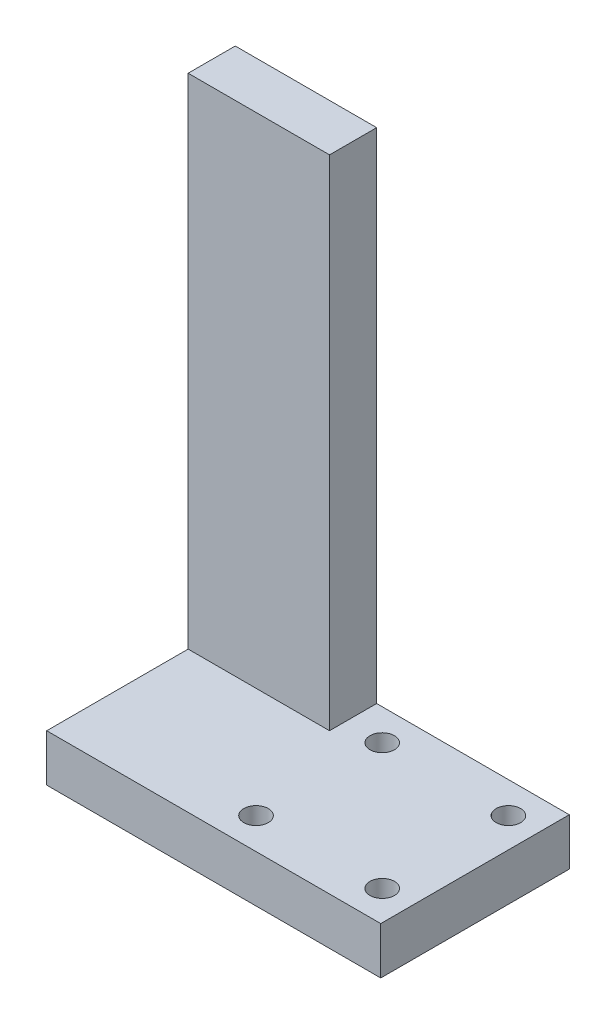
ISO-10303-21;
HEADER;
FILE_DESCRIPTION(('STEP AP214'),'2;1');
FILE_NAME('part.step','',(''),(''),'','','');
FILE_SCHEMA(('AUTOMOTIVE_DESIGN { 1 0 10303 214 1 1 1 1 }'));
ENDSEC;
DATA;
#1=APPLICATION_CONTEXT('core data for automotive mechanical design processes');
#2=APPLICATION_PROTOCOL_DEFINITION('international standard','automotive_design',2000,#1);
#3=PRODUCT_CONTEXT('',#1,'mechanical');
#4=PRODUCT('Part','Part','',(#3));
#5=PRODUCT_RELATED_PRODUCT_CATEGORY('part','',(#4));
#6=PRODUCT_DEFINITION_FORMATION('','',#4);
#7=PRODUCT_DEFINITION_CONTEXT('part definition',#1,'design');
#8=PRODUCT_DEFINITION('design','',#6,#7);
#9=PRODUCT_DEFINITION_SHAPE('','',#8);
#10=(LENGTH_UNIT() NAMED_UNIT(*) SI_UNIT(.MILLI.,.METRE.));
#11=(NAMED_UNIT(*) PLANE_ANGLE_UNIT() SI_UNIT($,.RADIAN.));
#12=(NAMED_UNIT(*) SI_UNIT($,.STERADIAN.) SOLID_ANGLE_UNIT());
#13=UNCERTAINTY_MEASURE_WITH_UNIT(LENGTH_MEASURE(1.E-05),#10,'distance_accuracy_value','');
#14=(GEOMETRIC_REPRESENTATION_CONTEXT(3) GLOBAL_UNCERTAINTY_ASSIGNED_CONTEXT((#13)) GLOBAL_UNIT_ASSIGNED_CONTEXT((#10,
#11,#12)) REPRESENTATION_CONTEXT('',''));
#15=CARTESIAN_POINT('',(0.,0.,0.));
#16=DIRECTION('',(0.,0.,1.));
#17=DIRECTION('',(1.,0.,0.));
#18=AXIS2_PLACEMENT_3D('',#15,#16,#17);
#19=CARTESIAN_POINT('',(0.,6.35,0.));
#20=DIRECTION('',(0.,-1.,0.));
#21=DIRECTION('',(0.,0.,-1.));
#22=AXIS2_PLACEMENT_3D('',#19,#20,#21);
#23=PLANE('',#22);
#24=CARTESIAN_POINT('',(3.00000000002082,6.35,-17.));
#25=DIRECTION('',(0.,-1.,0.));
#26=DIRECTION('',(0.,0.,-1.));
#27=AXIS2_PLACEMENT_3D('',#24,#25,#26);
#28=CIRCLE('',#27,3.3);
#29=CARTESIAN_POINT('',(3.00000000002082,6.35,-20.3));
#30=VERTEX_POINT('',#29);
#31=EDGE_CURVE('E141',#30,#30,#28,.T.);
#32=ORIENTED_EDGE('',*,*,#31,.T.);
#33=EDGE_LOOP('',(#32));
#34=FACE_BOUND('',#33,.T.);
#35=CARTESIAN_POINT('',(3.00000000002082,6.35,17.));
#36=DIRECTION('',(0.,-1.,0.));
#37=DIRECTION('',(0.,0.,-1.));
#38=AXIS2_PLACEMENT_3D('',#35,#36,#37);
#39=CIRCLE('',#38,3.3);
#40=CARTESIAN_POINT('',(3.00000000002082,6.35,13.7));
#41=VERTEX_POINT('',#40);
#42=EDGE_CURVE('E135',#41,#41,#39,.T.);
#43=ORIENTED_EDGE('',*,*,#42,.T.);
#44=EDGE_LOOP('',(#43));
#45=FACE_BOUND('',#44,.T.);
#46=CARTESIAN_POINT('',(37.0000000000208,6.35,-17.));
#47=DIRECTION('',(0.,-1.,0.));
#48=DIRECTION('',(0.,0.,-1.));
#49=AXIS2_PLACEMENT_3D('',#46,#47,#48);
#50=CIRCLE('',#49,3.3);
#51=CARTESIAN_POINT('',(37.0000000000208,6.35,-20.3));
#52=VERTEX_POINT('',#51);
#53=EDGE_CURVE('E129',#52,#52,#50,.T.);
#54=ORIENTED_EDGE('',*,*,#53,.T.);
#55=EDGE_LOOP('',(#54));
#56=FACE_BOUND('',#55,.T.);
#57=CARTESIAN_POINT('',(37.0000000000208,6.35,17.));
#58=DIRECTION('',(0.,-1.,0.));
#59=DIRECTION('',(0.,0.,-1.));
#60=AXIS2_PLACEMENT_3D('',#57,#58,#59);
#61=CIRCLE('',#60,3.3);
#62=CARTESIAN_POINT('',(37.0000000000208,6.35,13.7));
#63=VERTEX_POINT('',#62);
#64=EDGE_CURVE('E117',#63,#63,#61,.T.);
#65=ORIENTED_EDGE('',*,*,#64,.T.);
#66=EDGE_LOOP('',(#65));
#67=FACE_BOUND('',#66,.T.);
#68=DIRECTION('',(0.,0.,-1.));
#69=VECTOR('',#68,1.);
#70=CARTESIAN_POINT('',(-6.9,6.35,-25.4));
#71=LINE('',#70,#69);
#72=CARTESIAN_POINT('',(-6.9,6.35,-12.7));
#73=VERTEX_POINT('',#72);
#74=CARTESIAN_POINT('',(-6.89999999999999,6.35,-25.4));
#75=VERTEX_POINT('',#74);
#76=EDGE_CURVE('E112',#73,#75,#71,.T.);
#77=ORIENTED_EDGE('',*,*,#76,.F.);
#78=DIRECTION('',(1.,0.,0.));
#79=VECTOR('',#78,1.);
#80=CARTESIAN_POINT('',(-6.9,6.35,-12.7));
#81=LINE('',#80,#79);
#82=CARTESIAN_POINT('',(-45.,6.35,-12.7));
#83=VERTEX_POINT('',#82);
#84=EDGE_CURVE('E54',#83,#73,#81,.T.);
#85=ORIENTED_EDGE('',*,*,#84,.F.);
#86=DIRECTION('',(0.,0.,1.));
#87=VECTOR('',#86,1.);
#88=CARTESIAN_POINT('',(-45.,6.35,-25.4));
#89=LINE('',#88,#87);
#90=CARTESIAN_POINT('',(-45.,6.35,25.4));
#91=VERTEX_POINT('',#90);
#92=EDGE_CURVE('E145',#83,#91,#89,.T.);
#93=ORIENTED_EDGE('',*,*,#92,.T.);
#94=DIRECTION('',(1.,0.,0.));
#95=VECTOR('',#94,1.);
#96=CARTESIAN_POINT('',(45.,6.35,25.4));
#97=LINE('',#96,#95);
#98=CARTESIAN_POINT('',(45.,6.35,25.4));
#99=VERTEX_POINT('',#98);
#100=EDGE_CURVE('E147',#91,#99,#97,.T.);
#101=ORIENTED_EDGE('',*,*,#100,.T.);
#102=DIRECTION('',(0.,0.,-1.));
#103=VECTOR('',#102,1.);
#104=CARTESIAN_POINT('',(45.,6.35,-25.4));
#105=LINE('',#104,#103);
#106=CARTESIAN_POINT('',(45.,6.35,-25.4));
#107=VERTEX_POINT('',#106);
#108=EDGE_CURVE('E150',#99,#107,#105,.T.);
#109=ORIENTED_EDGE('',*,*,#108,.T.);
#110=DIRECTION('',(-1.,0.,0.));
#111=VECTOR('',#110,1.);
#112=CARTESIAN_POINT('',(45.,6.35,-25.4));
#113=LINE('',#112,#111);
#114=EDGE_CURVE('E48',#107,#75,#113,.T.);
#115=ORIENTED_EDGE('',*,*,#114,.T.);
#116=EDGE_LOOP('',(#77,#85,#93,#101,#109,#115));
#117=FACE_BOUND('',#116,.T.);
#118=ADVANCED_FACE('F33',(#34,#45,#56,#67,#117),#23,.F.);
#119=CARTESIAN_POINT('',(-45.,6.35,-25.4));
#120=DIRECTION('',(1.,0.,0.));
#121=DIRECTION('',(0.,0.,-1.));
#122=AXIS2_PLACEMENT_3D('',#119,#120,#121);
#123=PLANE('',#122);
#124=DIRECTION('',(0.,0.,1.));
#125=VECTOR('',#124,1.);
#126=CARTESIAN_POINT('',(-45.,-6.35,-25.4));
#127=LINE('',#126,#125);
#128=CARTESIAN_POINT('',(-45.,-6.35,-25.4));
#129=VERTEX_POINT('',#128);
#130=CARTESIAN_POINT('',(-45.,-6.35,25.4));
#131=VERTEX_POINT('',#130);
#132=EDGE_CURVE('E144',#129,#131,#127,.T.);
#133=ORIENTED_EDGE('',*,*,#132,.T.);
#134=DIRECTION('',(0.,-1.,0.));
#135=VECTOR('',#134,1.);
#136=CARTESIAN_POINT('',(-45.,6.35,25.4));
#137=LINE('',#136,#135);
#138=EDGE_CURVE('E11',#91,#131,#137,.T.);
#139=ORIENTED_EDGE('',*,*,#138,.F.);
#140=ORIENTED_EDGE('',*,*,#92,.F.);
#141=DIRECTION('',(0.,-1.,0.));
#142=VECTOR('',#141,1.);
#143=CARTESIAN_POINT('',(-45.,140.73,-12.7));
#144=LINE('',#143,#142);
#145=CARTESIAN_POINT('',(-45.,140.73,-12.7));
#146=VERTEX_POINT('',#145);
#147=EDGE_CURVE('E114',#146,#83,#144,.T.);
#148=ORIENTED_EDGE('',*,*,#147,.F.);
#149=DIRECTION('',(0.,0.,1.));
#150=VECTOR('',#149,1.);
#151=CARTESIAN_POINT('',(-45.,140.73,-25.4));
#152=LINE('',#151,#150);
#153=CARTESIAN_POINT('',(-45.,140.73,-25.4));
#154=VERTEX_POINT('',#153);
#155=EDGE_CURVE('E100',#154,#146,#152,.T.);
#156=ORIENTED_EDGE('',*,*,#155,.F.);
#157=DIRECTION('',(0.,-1.,0.));
#158=VECTOR('',#157,1.);
#159=CARTESIAN_POINT('',(-45.,6.35,-25.4));
#160=LINE('',#159,#158);
#161=EDGE_CURVE('E97',#154,#129,#160,.T.);
#162=ORIENTED_EDGE('',*,*,#161,.T.);
#163=EDGE_LOOP('',(#133,#139,#140,#148,#156,#162));
#164=FACE_BOUND('',#163,.T.);
#165=ADVANCED_FACE('F35',(#164),#123,.F.);
#166=CARTESIAN_POINT('',(45.,6.35,25.4));
#167=DIRECTION('',(0.,0.,-1.));
#168=DIRECTION('',(-1.,0.,0.));
#169=AXIS2_PLACEMENT_3D('',#166,#167,#168);
#170=PLANE('',#169);
#171=DIRECTION('',(1.,0.,0.));
#172=VECTOR('',#171,1.);
#173=CARTESIAN_POINT('',(45.,-6.35,25.4));
#174=LINE('',#173,#172);
#175=CARTESIAN_POINT('',(45.,-6.35,25.4));
#176=VERTEX_POINT('',#175);
#177=EDGE_CURVE('E155',#131,#176,#174,.T.);
#178=ORIENTED_EDGE('',*,*,#177,.T.);
#179=DIRECTION('',(0.,-1.,0.));
#180=VECTOR('',#179,1.);
#181=CARTESIAN_POINT('',(45.,6.35,25.4));
#182=LINE('',#181,#180);
#183=EDGE_CURVE('E41',#99,#176,#182,.T.);
#184=ORIENTED_EDGE('',*,*,#183,.F.);
#185=ORIENTED_EDGE('',*,*,#100,.F.);
#186=ORIENTED_EDGE('',*,*,#138,.T.);
#187=EDGE_LOOP('',(#178,#184,#185,#186));
#188=FACE_BOUND('',#187,.T.);
#189=ADVANCED_FACE('F200',(#188),#170,.F.);
#190=CARTESIAN_POINT('',(45.,6.35,-25.4));
#191=DIRECTION('',(-1.,0.,0.));
#192=DIRECTION('',(0.,0.,1.));
#193=AXIS2_PLACEMENT_3D('',#190,#191,#192);
#194=PLANE('',#193);
#195=DIRECTION('',(0.,0.,-1.));
#196=VECTOR('',#195,1.);
#197=CARTESIAN_POINT('',(45.,-6.35,-25.4));
#198=LINE('',#197,#196);
#199=CARTESIAN_POINT('',(45.,-6.35,-25.4));
#200=VERTEX_POINT('',#199);
#201=EDGE_CURVE('E157',#176,#200,#198,.T.);
#202=ORIENTED_EDGE('',*,*,#201,.T.);
#203=DIRECTION('',(0.,-1.,0.));
#204=VECTOR('',#203,1.);
#205=CARTESIAN_POINT('',(45.,6.35,-25.4));
#206=LINE('',#205,#204);
#207=EDGE_CURVE('E161',#107,#200,#206,.T.);
#208=ORIENTED_EDGE('',*,*,#207,.F.);
#209=ORIENTED_EDGE('',*,*,#108,.F.);
#210=ORIENTED_EDGE('',*,*,#183,.T.);
#211=EDGE_LOOP('',(#202,#208,#209,#210));
#212=FACE_BOUND('',#211,.T.);
#213=ADVANCED_FACE('F168',(#212),#194,.F.);
#214=CARTESIAN_POINT('',(45.,6.35,-25.4));
#215=DIRECTION('',(0.,0.,1.));
#216=DIRECTION('',(1.,0.,0.));
#217=AXIS2_PLACEMENT_3D('',#214,#215,#216);
#218=PLANE('',#217);
#219=DIRECTION('',(-1.,0.,0.));
#220=VECTOR('',#219,1.);
#221=CARTESIAN_POINT('',(45.,-6.35,-25.4));
#222=LINE('',#221,#220);
#223=EDGE_CURVE('E148',#200,#129,#222,.T.);
#224=ORIENTED_EDGE('',*,*,#223,.T.);
#225=ORIENTED_EDGE('',*,*,#161,.F.);
#226=DIRECTION('',(-1.,0.,0.));
#227=VECTOR('',#226,1.);
#228=CARTESIAN_POINT('',(-6.9,140.73,-25.4));
#229=LINE('',#228,#227);
#230=CARTESIAN_POINT('',(-6.9,140.73,-25.4));
#231=VERTEX_POINT('',#230);
#232=EDGE_CURVE('E90',#231,#154,#229,.T.);
#233=ORIENTED_EDGE('',*,*,#232,.F.);
#234=DIRECTION('',(0.,-1.,0.));
#235=VECTOR('',#234,1.);
#236=CARTESIAN_POINT('',(-6.9,140.73,-25.4));
#237=LINE('',#236,#235);
#238=EDGE_CURVE('E94',#231,#75,#237,.T.);
#239=ORIENTED_EDGE('',*,*,#238,.T.);
#240=ORIENTED_EDGE('',*,*,#114,.F.);
#241=ORIENTED_EDGE('',*,*,#207,.T.);
#242=EDGE_LOOP('',(#224,#225,#233,#239,#240,#241));
#243=FACE_BOUND('',#242,.T.);
#244=ADVANCED_FACE('F92',(#243),#218,.F.);
#245=CARTESIAN_POINT('',(0.,-6.35,0.));
#246=DIRECTION('',(0.,-1.,0.));
#247=DIRECTION('',(0.,0.,-1.));
#248=AXIS2_PLACEMENT_3D('',#245,#246,#247);
#249=PLANE('',#248);
#250=CARTESIAN_POINT('',(37.0000000000208,-6.35,17.));
#251=DIRECTION('',(0.,-1.,0.));
#252=DIRECTION('',(0.,0.,-1.));
#253=AXIS2_PLACEMENT_3D('',#250,#251,#252);
#254=CIRCLE('',#253,3.3);
#255=CARTESIAN_POINT('',(37.0000000000208,-6.35,13.7));
#256=VERTEX_POINT('',#255);
#257=EDGE_CURVE('E113',#256,#256,#254,.T.);
#258=ORIENTED_EDGE('',*,*,#257,.F.);
#259=EDGE_LOOP('',(#258));
#260=FACE_BOUND('',#259,.T.);
#261=CARTESIAN_POINT('',(37.0000000000208,-6.35,-17.));
#262=DIRECTION('',(0.,-1.,0.));
#263=DIRECTION('',(0.,0.,-1.));
#264=AXIS2_PLACEMENT_3D('',#261,#262,#263);
#265=CIRCLE('',#264,3.3);
#266=CARTESIAN_POINT('',(37.0000000000208,-6.35,-20.3));
#267=VERTEX_POINT('',#266);
#268=EDGE_CURVE('E126',#267,#267,#265,.T.);
#269=ORIENTED_EDGE('',*,*,#268,.F.);
#270=EDGE_LOOP('',(#269));
#271=FACE_BOUND('',#270,.T.);
#272=CARTESIAN_POINT('',(3.00000000002082,-6.35,17.));
#273=DIRECTION('',(0.,-1.,0.));
#274=DIRECTION('',(0.,0.,-1.));
#275=AXIS2_PLACEMENT_3D('',#272,#273,#274);
#276=CIRCLE('',#275,3.3);
#277=CARTESIAN_POINT('',(3.00000000002082,-6.35,13.7));
#278=VERTEX_POINT('',#277);
#279=EDGE_CURVE('E132',#278,#278,#276,.T.);
#280=ORIENTED_EDGE('',*,*,#279,.F.);
#281=EDGE_LOOP('',(#280));
#282=FACE_BOUND('',#281,.T.);
#283=CARTESIAN_POINT('',(3.00000000002082,-6.35,-17.));
#284=DIRECTION('',(0.,-1.,0.));
#285=DIRECTION('',(0.,0.,-1.));
#286=AXIS2_PLACEMENT_3D('',#283,#284,#285);
#287=CIRCLE('',#286,3.3);
#288=CARTESIAN_POINT('',(3.00000000002082,-6.35,-20.3));
#289=VERTEX_POINT('',#288);
#290=EDGE_CURVE('E138',#289,#289,#287,.T.);
#291=ORIENTED_EDGE('',*,*,#290,.F.);
#292=EDGE_LOOP('',(#291));
#293=FACE_BOUND('',#292,.T.);
#294=ORIENTED_EDGE('',*,*,#132,.F.);
#295=ORIENTED_EDGE('',*,*,#223,.F.);
#296=ORIENTED_EDGE('',*,*,#201,.F.);
#297=ORIENTED_EDGE('',*,*,#177,.F.);
#298=EDGE_LOOP('',(#294,#295,#296,#297));
#299=FACE_BOUND('',#298,.T.);
#300=ADVANCED_FACE('F175',(#260,#271,#282,#293,#299),#249,.T.);
#301=CARTESIAN_POINT('',(3.00000000002082,-6.35,-17.));
#302=DIRECTION('',(0.,-1.,0.));
#303=DIRECTION('',(0.,0.,-1.));
#304=AXIS2_PLACEMENT_3D('',#301,#302,#303);
#305=CYLINDRICAL_SURFACE('',#304,3.3);
#306=ORIENTED_EDGE('',*,*,#31,.F.);
#307=EDGE_LOOP('',(#306));
#308=FACE_BOUND('',#307,.T.);
#309=ORIENTED_EDGE('',*,*,#290,.T.);
#310=EDGE_LOOP('',(#309));
#311=FACE_BOUND('',#310,.T.);
#312=ADVANCED_FACE('F204',(#308,#311),#305,.F.);
#313=CARTESIAN_POINT('',(3.00000000002082,-6.35,17.));
#314=DIRECTION('',(0.,-1.,0.));
#315=DIRECTION('',(0.,0.,-1.));
#316=AXIS2_PLACEMENT_3D('',#313,#314,#315);
#317=CYLINDRICAL_SURFACE('',#316,3.3);
#318=ORIENTED_EDGE('',*,*,#42,.F.);
#319=EDGE_LOOP('',(#318));
#320=FACE_BOUND('',#319,.T.);
#321=ORIENTED_EDGE('',*,*,#279,.T.);
#322=EDGE_LOOP('',(#321));
#323=FACE_BOUND('',#322,.T.);
#324=ADVANCED_FACE('F236',(#320,#323),#317,.F.);
#325=CARTESIAN_POINT('',(37.0000000000208,-6.35,-17.));
#326=DIRECTION('',(0.,-1.,0.));
#327=DIRECTION('',(0.,0.,-1.));
#328=AXIS2_PLACEMENT_3D('',#325,#326,#327);
#329=CYLINDRICAL_SURFACE('',#328,3.3);
#330=ORIENTED_EDGE('',*,*,#53,.F.);
#331=EDGE_LOOP('',(#330));
#332=FACE_BOUND('',#331,.T.);
#333=ORIENTED_EDGE('',*,*,#268,.T.);
#334=EDGE_LOOP('',(#333));
#335=FACE_BOUND('',#334,.T.);
#336=ADVANCED_FACE('F243',(#332,#335),#329,.F.);
#337=CARTESIAN_POINT('',(37.0000000000208,-6.35,17.));
#338=DIRECTION('',(0.,-1.,0.));
#339=DIRECTION('',(0.,0.,-1.));
#340=AXIS2_PLACEMENT_3D('',#337,#338,#339);
#341=CYLINDRICAL_SURFACE('',#340,3.3);
#342=ORIENTED_EDGE('',*,*,#64,.F.);
#343=EDGE_LOOP('',(#342));
#344=FACE_BOUND('',#343,.T.);
#345=ORIENTED_EDGE('',*,*,#257,.T.);
#346=EDGE_LOOP('',(#345));
#347=FACE_BOUND('',#346,.T.);
#348=ADVANCED_FACE('F192',(#344,#347),#341,.F.);
#349=CARTESIAN_POINT('',(-6.9,140.73,-25.4));
#350=DIRECTION('',(-1.,0.,0.));
#351=DIRECTION('',(0.,0.,1.));
#352=AXIS2_PLACEMENT_3D('',#349,#350,#351);
#353=PLANE('',#352);
#354=ORIENTED_EDGE('',*,*,#76,.T.);
#355=ORIENTED_EDGE('',*,*,#238,.F.);
#356=DIRECTION('',(0.,0.,-1.));
#357=VECTOR('',#356,1.);
#358=CARTESIAN_POINT('',(-6.9,140.73,-25.4));
#359=LINE('',#358,#357);
#360=CARTESIAN_POINT('',(-6.9,140.73,-12.7));
#361=VERTEX_POINT('',#360);
#362=EDGE_CURVE('E101',#361,#231,#359,.T.);
#363=ORIENTED_EDGE('',*,*,#362,.F.);
#364=DIRECTION('',(0.,-1.,0.));
#365=VECTOR('',#364,1.);
#366=CARTESIAN_POINT('',(-6.9,140.73,-12.7));
#367=LINE('',#366,#365);
#368=EDGE_CURVE('E120',#361,#73,#367,.T.);
#369=ORIENTED_EDGE('',*,*,#368,.T.);
#370=EDGE_LOOP('',(#354,#355,#363,#369));
#371=FACE_BOUND('',#370,.T.);
#372=ADVANCED_FACE('F111',(#371),#353,.F.);
#373=CARTESIAN_POINT('',(-6.9,140.73,-12.7));
#374=DIRECTION('',(0.,0.,-1.));
#375=DIRECTION('',(-1.,0.,0.));
#376=AXIS2_PLACEMENT_3D('',#373,#374,#375);
#377=PLANE('',#376);
#378=ORIENTED_EDGE('',*,*,#84,.T.);
#379=ORIENTED_EDGE('',*,*,#368,.F.);
#380=DIRECTION('',(1.,0.,0.));
#381=VECTOR('',#380,1.);
#382=CARTESIAN_POINT('',(-6.9,140.73,-12.7));
#383=LINE('',#382,#381);
#384=EDGE_CURVE('E106',#146,#361,#383,.T.);
#385=ORIENTED_EDGE('',*,*,#384,.F.);
#386=ORIENTED_EDGE('',*,*,#147,.T.);
#387=EDGE_LOOP('',(#378,#379,#385,#386));
#388=FACE_BOUND('',#387,.T.);
#389=ADVANCED_FACE('F184',(#388),#377,.F.);
#390=CARTESIAN_POINT('',(0.,140.73,0.));
#391=DIRECTION('',(0.,-1.,0.));
#392=DIRECTION('',(0.,0.,-1.));
#393=AXIS2_PLACEMENT_3D('',#390,#391,#392);
#394=PLANE('',#393);
#395=ORIENTED_EDGE('',*,*,#362,.T.);
#396=ORIENTED_EDGE('',*,*,#232,.T.);
#397=ORIENTED_EDGE('',*,*,#155,.T.);
#398=ORIENTED_EDGE('',*,*,#384,.T.);
#399=EDGE_LOOP('',(#395,#396,#397,#398));
#400=FACE_BOUND('',#399,.T.);
#401=ADVANCED_FACE('F104',(#400),#394,.F.);
#402=CLOSED_SHELL('',(#118,#165,#189,#213,#244,#300,#312,#324,#336,#348,#372,#389,#401));
#403=MANIFOLD_SOLID_BREP('B2',#402);
#404=ADVANCED_BREP_SHAPE_REPRESENTATION('',(#18,#403),#14);
#405=SHAPE_DEFINITION_REPRESENTATION(#9,#404);
ENDSEC;
END-ISO-10303-21;
